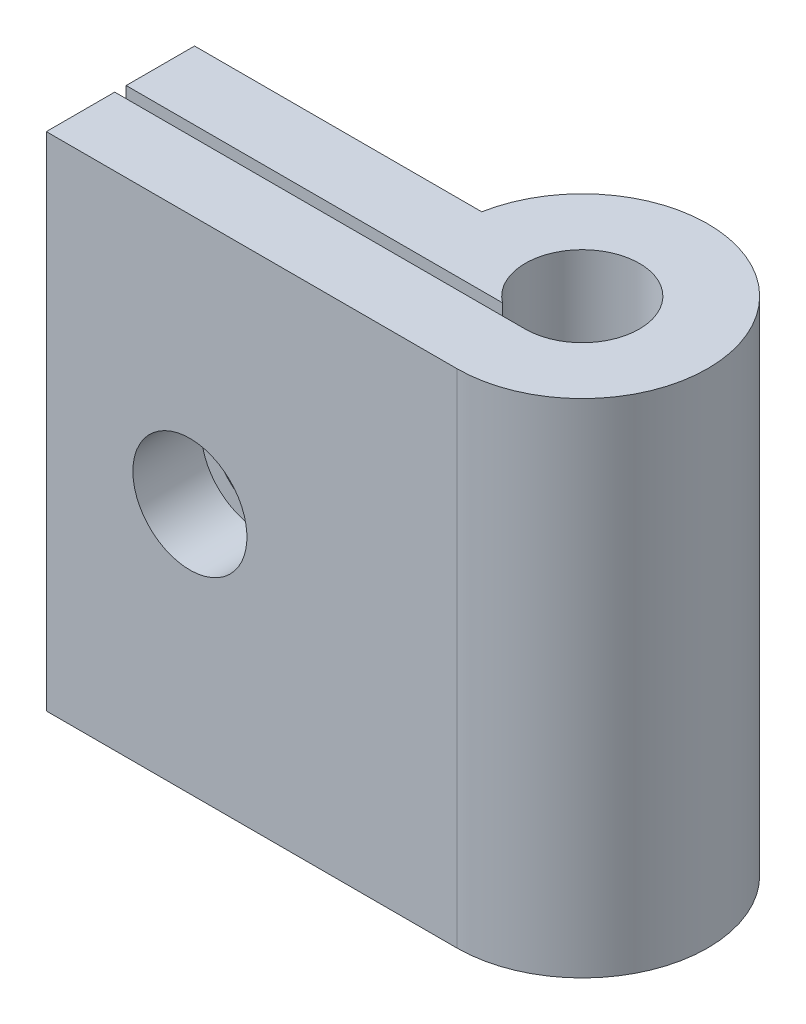
ISO-10303-21;
HEADER;
FILE_DESCRIPTION(('STEP AP214'),'2;1');
FILE_NAME('part.step','',(''),(''),'','','');
FILE_SCHEMA(('AUTOMOTIVE_DESIGN { 1 0 10303 214 1 1 1 1 }'));
ENDSEC;
DATA;
#1=APPLICATION_CONTEXT('core data for automotive mechanical design processes');
#2=APPLICATION_PROTOCOL_DEFINITION('international standard','automotive_design',2000,#1);
#3=PRODUCT_CONTEXT('',#1,'mechanical');
#4=PRODUCT('Part','Part','',(#3));
#5=PRODUCT_RELATED_PRODUCT_CATEGORY('part','',(#4));
#6=PRODUCT_DEFINITION_FORMATION('','',#4);
#7=PRODUCT_DEFINITION_CONTEXT('part definition',#1,'design');
#8=PRODUCT_DEFINITION('design','',#6,#7);
#9=PRODUCT_DEFINITION_SHAPE('','',#8);
#10=(LENGTH_UNIT() NAMED_UNIT(*) SI_UNIT(.MILLI.,.METRE.));
#11=(NAMED_UNIT(*) PLANE_ANGLE_UNIT() SI_UNIT($,.RADIAN.));
#12=(NAMED_UNIT(*) SI_UNIT($,.STERADIAN.) SOLID_ANGLE_UNIT());
#13=UNCERTAINTY_MEASURE_WITH_UNIT(LENGTH_MEASURE(1.E-05),#10,'distance_accuracy_value','');
#14=(GEOMETRIC_REPRESENTATION_CONTEXT(3) GLOBAL_UNCERTAINTY_ASSIGNED_CONTEXT((#13)) GLOBAL_UNIT_ASSIGNED_CONTEXT((#10,
#11,#12)) REPRESENTATION_CONTEXT('',''));
#15=CARTESIAN_POINT('',(0.,0.,0.));
#16=DIRECTION('',(0.,0.,1.));
#17=DIRECTION('',(1.,0.,0.));
#18=AXIS2_PLACEMENT_3D('',#15,#16,#17);
#19=CARTESIAN_POINT('',(0.,22.,0.));
#20=DIRECTION('',(0.,-1.,0.));
#21=DIRECTION('',(0.,0.,-1.));
#22=AXIS2_PLACEMENT_3D('',#19,#20,#21);
#23=CYLINDRICAL_SURFACE('',#22,5.5);
#24=CARTESIAN_POINT('',(0.,0.,0.));
#25=DIRECTION('',(0.,1.,0.));
#26=DIRECTION('',(0.,0.,1.));
#27=AXIS2_PLACEMENT_3D('',#24,#25,#26);
#28=CIRCLE('',#27,5.5);
#29=CARTESIAN_POINT('',(0.,0.,5.5));
#30=VERTEX_POINT('',#29);
#31=CARTESIAN_POINT('',(-5.40832691319598,0.,-1.));
#32=VERTEX_POINT('',#31);
#33=EDGE_CURVE('E128',#30,#32,#28,.T.);
#34=ORIENTED_EDGE('',*,*,#33,.T.);
#35=DIRECTION('',(0.,-1.,0.));
#36=VECTOR('',#35,1.);
#37=CARTESIAN_POINT('',(-5.40832691319598,22.,-1.));
#38=LINE('',#37,#36);
#39=CARTESIAN_POINT('',(-5.40832691319598,22.,-1.));
#40=VERTEX_POINT('',#39);
#41=EDGE_CURVE('E11',#40,#32,#38,.T.);
#42=ORIENTED_EDGE('',*,*,#41,.F.);
#43=CARTESIAN_POINT('',(0.,22.,0.));
#44=DIRECTION('',(0.,1.,0.));
#45=DIRECTION('',(0.,0.,1.));
#46=AXIS2_PLACEMENT_3D('',#43,#44,#45);
#47=CIRCLE('',#46,5.5);
#48=CARTESIAN_POINT('',(0.,22.,5.5));
#49=VERTEX_POINT('',#48);
#50=EDGE_CURVE('E145',#49,#40,#47,.T.);
#51=ORIENTED_EDGE('',*,*,#50,.F.);
#52=DIRECTION('',(0.,-1.,0.));
#53=VECTOR('',#52,1.);
#54=CARTESIAN_POINT('',(0.,22.,5.5));
#55=LINE('',#54,#53);
#56=EDGE_CURVE('E124',#49,#30,#55,.T.);
#57=ORIENTED_EDGE('',*,*,#56,.T.);
#58=EDGE_LOOP('',(#34,#42,#51,#57));
#59=FACE_BOUND('',#58,.T.);
#60=ADVANCED_FACE('F32',(#59),#23,.T.);
#61=CARTESIAN_POINT('',(-18.,22.,-1.));
#62=DIRECTION('',(0.,0.,1.));
#63=DIRECTION('',(1.,0.,0.));
#64=AXIS2_PLACEMENT_3D('',#61,#62,#63);
#65=PLANE('',#64);
#66=CARTESIAN_POINT('',(-11.704163456598,11.,-1.));
#67=DIRECTION('',(0.,0.,-1.));
#68=DIRECTION('',(-1.,0.,0.));
#69=AXIS2_PLACEMENT_3D('',#66,#67,#68);
#70=CIRCLE('',#69,2.5);
#71=CARTESIAN_POINT('',(-14.204163456598,11.,-1.));
#72=VERTEX_POINT('',#71);
#73=EDGE_CURVE('E183',#72,#72,#70,.T.);
#74=ORIENTED_EDGE('',*,*,#73,.F.);
#75=EDGE_LOOP('',(#74));
#76=FACE_BOUND('',#75,.T.);
#77=DIRECTION('',(-1.,0.,0.));
#78=VECTOR('',#77,1.);
#79=CARTESIAN_POINT('',(-18.,0.,-1.));
#80=LINE('',#79,#78);
#81=CARTESIAN_POINT('',(-18.,0.,-1.));
#82=VERTEX_POINT('',#81);
#83=EDGE_CURVE('E131',#32,#82,#80,.T.);
#84=ORIENTED_EDGE('',*,*,#83,.T.);
#85=DIRECTION('',(0.,-1.,0.));
#86=VECTOR('',#85,1.);
#87=CARTESIAN_POINT('',(-18.,22.,-1.));
#88=LINE('',#87,#86);
#89=CARTESIAN_POINT('',(-18.,22.,-1.));
#90=VERTEX_POINT('',#89);
#91=EDGE_CURVE('E41',#90,#82,#88,.T.);
#92=ORIENTED_EDGE('',*,*,#91,.F.);
#93=DIRECTION('',(-1.,0.,0.));
#94=VECTOR('',#93,1.);
#95=CARTESIAN_POINT('',(-18.,22.,-1.));
#96=LINE('',#95,#94);
#97=EDGE_CURVE('E92',#40,#90,#96,.T.);
#98=ORIENTED_EDGE('',*,*,#97,.F.);
#99=ORIENTED_EDGE('',*,*,#41,.T.);
#100=EDGE_LOOP('',(#84,#92,#98,#99));
#101=FACE_BOUND('',#100,.T.);
#102=ADVANCED_FACE('F208',(#76,#101),#65,.F.);
#103=CARTESIAN_POINT('',(-18.,22.,2.));
#104=DIRECTION('',(1.,0.,0.));
#105=DIRECTION('',(0.,0.,-1.));
#106=AXIS2_PLACEMENT_3D('',#103,#104,#105);
#107=PLANE('',#106);
#108=DIRECTION('',(0.,0.,1.));
#109=VECTOR('',#108,1.);
#110=CARTESIAN_POINT('',(-18.,0.,2.));
#111=LINE('',#110,#109);
#112=CARTESIAN_POINT('',(-18.,0.,2.));
#113=VERTEX_POINT('',#112);
#114=EDGE_CURVE('E134',#82,#113,#111,.T.);
#115=ORIENTED_EDGE('',*,*,#114,.T.);
#116=DIRECTION('',(0.,-1.,0.));
#117=VECTOR('',#116,1.);
#118=CARTESIAN_POINT('',(-18.,22.,2.));
#119=LINE('',#118,#117);
#120=CARTESIAN_POINT('',(-18.,22.,2.));
#121=VERTEX_POINT('',#120);
#122=EDGE_CURVE('E152',#121,#113,#119,.T.);
#123=ORIENTED_EDGE('',*,*,#122,.F.);
#124=DIRECTION('',(0.,0.,1.));
#125=VECTOR('',#124,1.);
#126=CARTESIAN_POINT('',(-18.,22.,2.));
#127=LINE('',#126,#125);
#128=EDGE_CURVE('E161',#90,#121,#127,.T.);
#129=ORIENTED_EDGE('',*,*,#128,.F.);
#130=ORIENTED_EDGE('',*,*,#91,.T.);
#131=EDGE_LOOP('',(#115,#123,#129,#130));
#132=FACE_BOUND('',#131,.T.);
#133=ADVANCED_FACE('F159',(#132),#107,.F.);
#134=CARTESIAN_POINT('',(-6.46658194006561,22.,2.));
#135=DIRECTION('',(0.,0.,-1.));
#136=DIRECTION('',(-1.,0.,0.));
#137=AXIS2_PLACEMENT_3D('',#134,#135,#136);
#138=PLANE('',#137);
#139=CARTESIAN_POINT('',(-11.704163456598,11.,2.));
#140=DIRECTION('',(0.,0.,-1.));
#141=DIRECTION('',(-1.,0.,0.));
#142=AXIS2_PLACEMENT_3D('',#139,#140,#141);
#143=CIRCLE('',#142,2.5);
#144=CARTESIAN_POINT('',(-14.204163456598,11.,2.));
#145=VERTEX_POINT('',#144);
#146=EDGE_CURVE('E132',#145,#145,#143,.T.);
#147=ORIENTED_EDGE('',*,*,#146,.T.);
#148=EDGE_LOOP('',(#147));
#149=FACE_BOUND('',#148,.T.);
#150=DIRECTION('',(1.,0.,0.));
#151=VECTOR('',#150,1.);
#152=CARTESIAN_POINT('',(-6.46658194006561,0.,2.));
#153=LINE('',#152,#151);
#154=CARTESIAN_POINT('',(-1.5,0.,2.));
#155=VERTEX_POINT('',#154);
#156=EDGE_CURVE('E137',#113,#155,#153,.T.);
#157=ORIENTED_EDGE('',*,*,#156,.T.);
#158=DIRECTION('',(0.,-1.,0.));
#159=VECTOR('',#158,1.);
#160=CARTESIAN_POINT('',(-1.5,22.,2.));
#161=LINE('',#160,#159);
#162=CARTESIAN_POINT('',(-1.5,22.,2.));
#163=VERTEX_POINT('',#162);
#164=EDGE_CURVE('E149',#163,#155,#161,.T.);
#165=ORIENTED_EDGE('',*,*,#164,.F.);
#166=DIRECTION('',(1.,0.,0.));
#167=VECTOR('',#166,1.);
#168=CARTESIAN_POINT('',(-6.46658194006561,22.,2.));
#169=LINE('',#168,#167);
#170=EDGE_CURVE('E172',#121,#163,#169,.T.);
#171=ORIENTED_EDGE('',*,*,#170,.F.);
#172=ORIENTED_EDGE('',*,*,#122,.T.);
#173=EDGE_LOOP('',(#157,#165,#171,#172));
#174=FACE_BOUND('',#173,.T.);
#175=ADVANCED_FACE('F168',(#149,#174),#138,.F.);
#176=CARTESIAN_POINT('',(0.,22.,0.));
#177=DIRECTION('',(0.,-1.,0.));
#178=DIRECTION('',(0.,0.,-1.));
#179=AXIS2_PLACEMENT_3D('',#176,#177,#178);
#180=CYLINDRICAL_SURFACE('',#179,2.5);
#181=CARTESIAN_POINT('',(0.,0.,0.));
#182=DIRECTION('',(0.,-1.,0.));
#183=DIRECTION('',(0.,0.,1.));
#184=AXIS2_PLACEMENT_3D('',#181,#182,#183);
#185=CIRCLE('',#184,2.5);
#186=CARTESIAN_POINT('',(0.,0.,2.5));
#187=VERTEX_POINT('',#186);
#188=EDGE_CURVE('E139',#155,#187,#185,.T.);
#189=ORIENTED_EDGE('',*,*,#188,.T.);
#190=DIRECTION('',(0.,-1.,0.));
#191=VECTOR('',#190,1.);
#192=CARTESIAN_POINT('',(0.,22.,2.5));
#193=LINE('',#192,#191);
#194=CARTESIAN_POINT('',(0.,22.,2.5));
#195=VERTEX_POINT('',#194);
#196=EDGE_CURVE('E119',#195,#187,#193,.T.);
#197=ORIENTED_EDGE('',*,*,#196,.F.);
#198=CARTESIAN_POINT('',(0.,22.,0.));
#199=DIRECTION('',(0.,-1.,0.));
#200=DIRECTION('',(0.,0.,1.));
#201=AXIS2_PLACEMENT_3D('',#198,#199,#200);
#202=CIRCLE('',#201,2.5);
#203=EDGE_CURVE('E111',#163,#195,#202,.T.);
#204=ORIENTED_EDGE('',*,*,#203,.F.);
#205=ORIENTED_EDGE('',*,*,#164,.T.);
#206=EDGE_LOOP('',(#189,#197,#204,#205));
#207=FACE_BOUND('',#206,.T.);
#208=ADVANCED_FACE('F171',(#207),#180,.F.);
#209=CARTESIAN_POINT('',(-18.,22.,2.5));
#210=DIRECTION('',(0.,0.,1.));
#211=DIRECTION('',(1.,0.,0.));
#212=AXIS2_PLACEMENT_3D('',#209,#210,#211);
#213=PLANE('',#212);
#214=CARTESIAN_POINT('',(-11.704163456598,11.,2.5));
#215=DIRECTION('',(0.,0.,1.));
#216=DIRECTION('',(1.,0.,0.));
#217=AXIS2_PLACEMENT_3D('',#214,#215,#216);
#218=CIRCLE('',#217,2.5);
#219=CARTESIAN_POINT('',(-9.20416345659799,11.,2.5));
#220=VERTEX_POINT('',#219);
#221=EDGE_CURVE('E180',#220,#220,#218,.T.);
#222=ORIENTED_EDGE('',*,*,#221,.T.);
#223=EDGE_LOOP('',(#222));
#224=FACE_BOUND('',#223,.T.);
#225=DIRECTION('',(-1.,0.,0.));
#226=VECTOR('',#225,1.);
#227=CARTESIAN_POINT('',(-18.,0.,2.5));
#228=LINE('',#227,#226);
#229=CARTESIAN_POINT('',(-18.,0.,2.5));
#230=VERTEX_POINT('',#229);
#231=EDGE_CURVE('E118',#187,#230,#228,.T.);
#232=ORIENTED_EDGE('',*,*,#231,.T.);
#233=DIRECTION('',(0.,-1.,0.));
#234=VECTOR('',#233,1.);
#235=CARTESIAN_POINT('',(-18.,22.,2.5));
#236=LINE('',#235,#234);
#237=CARTESIAN_POINT('',(-18.,22.,2.5));
#238=VERTEX_POINT('',#237);
#239=EDGE_CURVE('E116',#238,#230,#236,.T.);
#240=ORIENTED_EDGE('',*,*,#239,.F.);
#241=DIRECTION('',(-1.,0.,0.));
#242=VECTOR('',#241,1.);
#243=CARTESIAN_POINT('',(-7.39959006466221,22.,2.5));
#244=LINE('',#243,#242);
#245=EDGE_CURVE('E105',#195,#238,#244,.T.);
#246=ORIENTED_EDGE('',*,*,#245,.F.);
#247=ORIENTED_EDGE('',*,*,#196,.T.);
#248=EDGE_LOOP('',(#232,#240,#246,#247));
#249=FACE_BOUND('',#248,.T.);
#250=ADVANCED_FACE('F117',(#224,#249),#213,.F.);
#251=CARTESIAN_POINT('',(-18.,22.,5.5));
#252=DIRECTION('',(1.,0.,0.));
#253=DIRECTION('',(0.,0.,-1.));
#254=AXIS2_PLACEMENT_3D('',#251,#252,#253);
#255=PLANE('',#254);
#256=DIRECTION('',(0.,0.,1.));
#257=VECTOR('',#256,1.);
#258=CARTESIAN_POINT('',(-18.,0.,5.5));
#259=LINE('',#258,#257);
#260=CARTESIAN_POINT('',(-18.,0.,5.5));
#261=VERTEX_POINT('',#260);
#262=EDGE_CURVE('E78',#230,#261,#259,.T.);
#263=ORIENTED_EDGE('',*,*,#262,.T.);
#264=DIRECTION('',(0.,-1.,0.));
#265=VECTOR('',#264,1.);
#266=CARTESIAN_POINT('',(-18.,22.,5.5));
#267=LINE('',#266,#265);
#268=CARTESIAN_POINT('',(-18.,22.,5.5));
#269=VERTEX_POINT('',#268);
#270=EDGE_CURVE('E120',#269,#261,#267,.T.);
#271=ORIENTED_EDGE('',*,*,#270,.F.);
#272=DIRECTION('',(0.,0.,1.));
#273=VECTOR('',#272,1.);
#274=CARTESIAN_POINT('',(-18.,22.,5.5));
#275=LINE('',#274,#273);
#276=EDGE_CURVE('E109',#238,#269,#275,.T.);
#277=ORIENTED_EDGE('',*,*,#276,.F.);
#278=ORIENTED_EDGE('',*,*,#239,.T.);
#279=EDGE_LOOP('',(#263,#271,#277,#278));
#280=FACE_BOUND('',#279,.T.);
#281=ADVANCED_FACE('F122',(#280),#255,.F.);
#282=CARTESIAN_POINT('',(0.,22.,5.5));
#283=DIRECTION('',(0.,0.,-1.));
#284=DIRECTION('',(-1.,0.,0.));
#285=AXIS2_PLACEMENT_3D('',#282,#283,#284);
#286=PLANE('',#285);
#287=CARTESIAN_POINT('',(-11.704163456598,11.,5.5));
#288=DIRECTION('',(0.,0.,-1.));
#289=DIRECTION('',(-1.,0.,0.));
#290=AXIS2_PLACEMENT_3D('',#287,#288,#289);
#291=CIRCLE('',#290,2.5);
#292=CARTESIAN_POINT('',(-14.204163456598,11.,5.5));
#293=VERTEX_POINT('',#292);
#294=EDGE_CURVE('E35',#293,#293,#291,.T.);
#295=ORIENTED_EDGE('',*,*,#294,.T.);
#296=EDGE_LOOP('',(#295));
#297=FACE_BOUND('',#296,.T.);
#298=DIRECTION('',(1.,0.,0.));
#299=VECTOR('',#298,1.);
#300=CARTESIAN_POINT('',(0.,0.,5.5));
#301=LINE('',#300,#299);
#302=EDGE_CURVE('E84',#261,#30,#301,.T.);
#303=ORIENTED_EDGE('',*,*,#302,.T.);
#304=ORIENTED_EDGE('',*,*,#56,.F.);
#305=DIRECTION('',(1.,0.,0.));
#306=VECTOR('',#305,1.);
#307=CARTESIAN_POINT('',(0.,22.,5.5));
#308=LINE('',#307,#306);
#309=EDGE_CURVE('E49',#269,#49,#308,.T.);
#310=ORIENTED_EDGE('',*,*,#309,.F.);
#311=ORIENTED_EDGE('',*,*,#270,.T.);
#312=EDGE_LOOP('',(#303,#304,#310,#311));
#313=FACE_BOUND('',#312,.T.);
#314=ADVANCED_FACE('F190',(#297,#313),#286,.F.);
#315=CARTESIAN_POINT('',(0.,22.,0.));
#316=DIRECTION('',(0.,1.,0.));
#317=DIRECTION('',(0.,0.,1.));
#318=AXIS2_PLACEMENT_3D('',#315,#316,#317);
#319=PLANE('',#318);
#320=ORIENTED_EDGE('',*,*,#50,.T.);
#321=ORIENTED_EDGE('',*,*,#97,.T.);
#322=ORIENTED_EDGE('',*,*,#128,.T.);
#323=ORIENTED_EDGE('',*,*,#170,.T.);
#324=ORIENTED_EDGE('',*,*,#203,.T.);
#325=ORIENTED_EDGE('',*,*,#245,.T.);
#326=ORIENTED_EDGE('',*,*,#276,.T.);
#327=ORIENTED_EDGE('',*,*,#309,.T.);
#328=EDGE_LOOP('',(#320,#321,#322,#323,#324,#325,#326,#327));
#329=FACE_BOUND('',#328,.T.);
#330=ADVANCED_FACE('F107',(#329),#319,.T.);
#331=CARTESIAN_POINT('',(0.,0.,0.));
#332=DIRECTION('',(0.,1.,0.));
#333=DIRECTION('',(0.,0.,1.));
#334=AXIS2_PLACEMENT_3D('',#331,#332,#333);
#335=PLANE('',#334);
#336=ORIENTED_EDGE('',*,*,#33,.F.);
#337=ORIENTED_EDGE('',*,*,#302,.F.);
#338=ORIENTED_EDGE('',*,*,#262,.F.);
#339=ORIENTED_EDGE('',*,*,#231,.F.);
#340=ORIENTED_EDGE('',*,*,#188,.F.);
#341=ORIENTED_EDGE('',*,*,#156,.F.);
#342=ORIENTED_EDGE('',*,*,#114,.F.);
#343=ORIENTED_EDGE('',*,*,#83,.F.);
#344=EDGE_LOOP('',(#336,#337,#338,#339,#340,#341,#342,#343));
#345=FACE_BOUND('',#344,.T.);
#346=ADVANCED_FACE('F164',(#345),#335,.F.);
#347=CARTESIAN_POINT('',(-11.704163456598,11.,14.));
#348=DIRECTION('',(0.,0.,-1.));
#349=DIRECTION('',(-1.,0.,0.));
#350=AXIS2_PLACEMENT_3D('',#347,#348,#349);
#351=CYLINDRICAL_SURFACE('',#350,2.5);
#352=ORIENTED_EDGE('',*,*,#294,.F.);
#353=EDGE_LOOP('',(#352));
#354=FACE_BOUND('',#353,.T.);
#355=ORIENTED_EDGE('',*,*,#221,.F.);
#356=EDGE_LOOP('',(#355));
#357=FACE_BOUND('',#356,.T.);
#358=ADVANCED_FACE('F192',(#354,#357),#351,.F.);
#359=ORIENTED_EDGE('',*,*,#73,.T.);
#360=EDGE_LOOP('',(#359));
#361=FACE_BOUND('',#360,.T.);
#362=ORIENTED_EDGE('',*,*,#146,.F.);
#363=EDGE_LOOP('',(#362));
#364=FACE_BOUND('',#363,.T.);
#365=ADVANCED_FACE('F195',(#361,#364),#351,.F.);
#366=CLOSED_SHELL('',(#60,#102,#133,#175,#208,#250,#281,#314,#330,#346,#358,#365));
#367=MANIFOLD_SOLID_BREP('B2',#366);
#368=ADVANCED_BREP_SHAPE_REPRESENTATION('',(#18,#367),#14);
#369=SHAPE_DEFINITION_REPRESENTATION(#9,#368);
ENDSEC;
END-ISO-10303-21;
